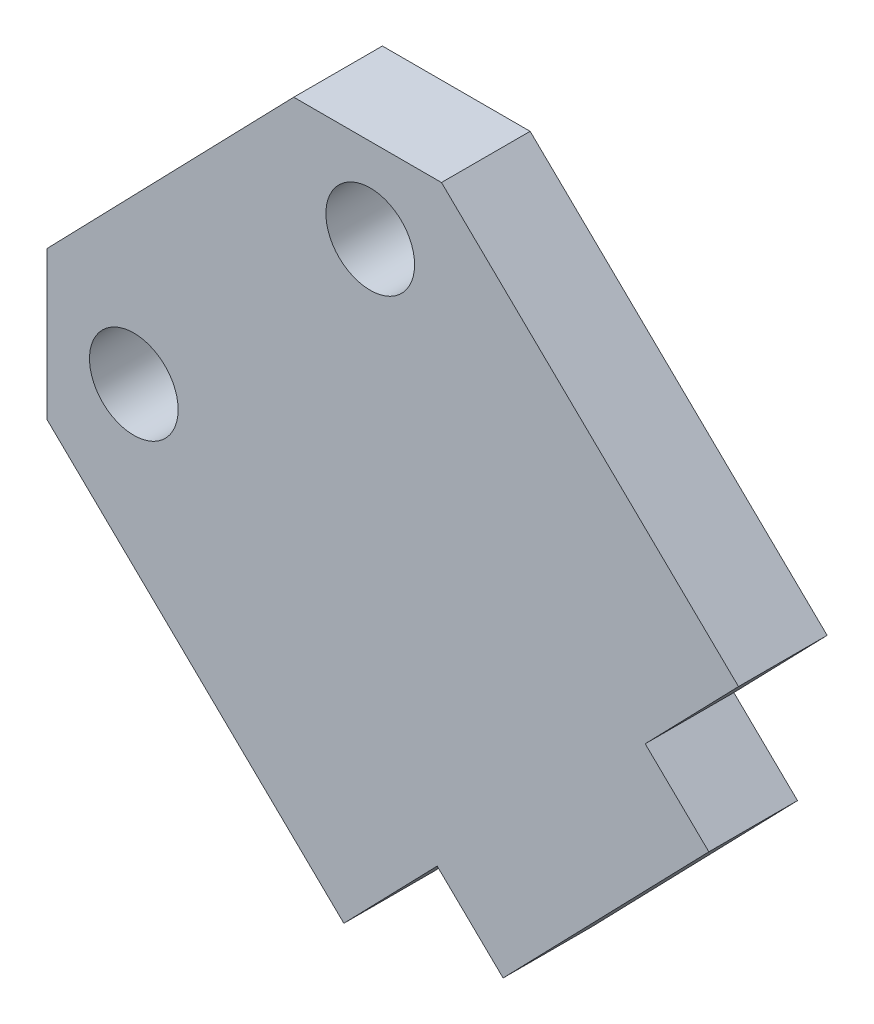
ISO-10303-21;
HEADER;
FILE_DESCRIPTION(('STEP AP214'),'2;1');
FILE_NAME('part.step','',(''),(''),'','','');
FILE_SCHEMA(('AUTOMOTIVE_DESIGN { 1 0 10303 214 1 1 1 1 }'));
ENDSEC;
DATA;
#1=APPLICATION_CONTEXT('core data for automotive mechanical design processes');
#2=APPLICATION_PROTOCOL_DEFINITION('international standard','automotive_design',2000,#1);
#3=PRODUCT_CONTEXT('',#1,'mechanical');
#4=PRODUCT('Part','Part','',(#3));
#5=PRODUCT_RELATED_PRODUCT_CATEGORY('part','',(#4));
#6=PRODUCT_DEFINITION_FORMATION('','',#4);
#7=PRODUCT_DEFINITION_CONTEXT('part definition',#1,'design');
#8=PRODUCT_DEFINITION('design','',#6,#7);
#9=PRODUCT_DEFINITION_SHAPE('','',#8);
#10=(LENGTH_UNIT() NAMED_UNIT(*) SI_UNIT(.MILLI.,.METRE.));
#11=(NAMED_UNIT(*) PLANE_ANGLE_UNIT() SI_UNIT($,.RADIAN.));
#12=(NAMED_UNIT(*) SI_UNIT($,.STERADIAN.) SOLID_ANGLE_UNIT());
#13=UNCERTAINTY_MEASURE_WITH_UNIT(LENGTH_MEASURE(1.E-05),#10,'distance_accuracy_value','');
#14=(GEOMETRIC_REPRESENTATION_CONTEXT(3) GLOBAL_UNCERTAINTY_ASSIGNED_CONTEXT((#13)) GLOBAL_UNIT_ASSIGNED_CONTEXT((#10,
#11,#12)) REPRESENTATION_CONTEXT('',''));
#15=CARTESIAN_POINT('',(0.,0.,0.));
#16=DIRECTION('',(0.,0.,1.));
#17=DIRECTION('',(1.,0.,0.));
#18=AXIS2_PLACEMENT_3D('',#15,#16,#17);
#19=CARTESIAN_POINT('',(0.,0.,3.));
#20=DIRECTION('',(0.,0.,-1.));
#21=DIRECTION('',(-1.,0.,0.));
#22=AXIS2_PLACEMENT_3D('',#19,#20,#21);
#23=PLANE('',#22);
#24=DIRECTION('',(0.,-1.,0.));
#25=VECTOR('',#24,1.);
#26=CARTESIAN_POINT('',(-10.9431024509209,-10.75,3.));
#27=LINE('',#26,#25);
#28=CARTESIAN_POINT('',(-10.9431024509209,-5.75,3.));
#29=VERTEX_POINT('',#28);
#30=CARTESIAN_POINT('',(-10.9431024509209,-10.75,3.));
#31=VERTEX_POINT('',#30);
#32=EDGE_CURVE('E169',#29,#31,#27,.T.);
#33=ORIENTED_EDGE('',*,*,#32,.T.);
#34=DIRECTION('',(0.717900393451055,-0.69614583607375,0.));
#35=VECTOR('',#34,1.);
#36=CARTESIAN_POINT('',(-0.892496942606136,-20.4960417050325,3.));
#37=LINE('',#36,#35);
#38=CARTESIAN_POINT('',(-0.892496942606136,-20.4960417050325,3.));
#39=VERTEX_POINT('',#38);
#40=EDGE_CURVE('E107',#31,#39,#37,.T.);
#41=ORIENTED_EDGE('',*,*,#40,.T.);
#42=DIRECTION('',(0.69614583607375,0.717900393451055,0.));
#43=VECTOR('',#42,1.);
#44=CARTESIAN_POINT('',(-0.892496942606136,-20.4960417050325,3.));
#45=LINE('',#44,#43);
#46=CARTESIAN_POINT('',(2.26460488021631,-17.2402804502468,3.));
#47=VERTEX_POINT('',#46);
#48=EDGE_CURVE('E190',#39,#47,#45,.T.);
#49=ORIENTED_EDGE('',*,*,#48,.T.);
#50=DIRECTION('',(0.717900393451054,-0.69614583607375,0.));
#51=VECTOR('',#50,1.);
#52=CARTESIAN_POINT('',(2.26460488021631,-17.2402804502468,3.));
#53=LINE('',#52,#51);
#54=CARTESIAN_POINT('',(4.49639408707208,-19.4044396811373,3.));
#55=VERTEX_POINT('',#54);
#56=EDGE_CURVE('E209',#47,#55,#53,.T.);
#57=ORIENTED_EDGE('',*,*,#56,.T.);
#58=DIRECTION('',(0.69614583607375,0.717900393451055,0.));
#59=VECTOR('',#58,1.);
#60=CARTESIAN_POINT('',(4.49639408707208,-19.4044396811373,3.));
#61=LINE('',#60,#59);
#62=CARTESIAN_POINT('',(11.4578524478096,-12.2254357466267,3.));
#63=VERTEX_POINT('',#62);
#64=EDGE_CURVE('E206',#55,#63,#61,.T.);
#65=ORIENTED_EDGE('',*,*,#64,.T.);
#66=DIRECTION('',(-0.717900393451056,0.696145836073749,0.));
#67=VECTOR('',#66,1.);
#68=CARTESIAN_POINT('',(11.4578524478096,-12.2254357466267,3.));
#69=LINE('',#68,#67);
#70=CARTESIAN_POINT('',(9.30415126745642,-10.1369982384055,3.));
#71=VERTEX_POINT('',#70);
#72=EDGE_CURVE('E208',#63,#71,#69,.T.);
#73=ORIENTED_EDGE('',*,*,#72,.T.);
#74=DIRECTION('',(0.69614583607375,0.717900393451055,0.));
#75=VECTOR('',#74,1.);
#76=CARTESIAN_POINT('',(9.30415126745642,-10.1369982384055,3.));
#77=LINE('',#76,#75);
#78=CARTESIAN_POINT('',(12.4612530902789,-6.88123698361985,3.));
#79=VERTEX_POINT('',#78);
#80=EDGE_CURVE('E132',#71,#79,#77,.T.);
#81=ORIENTED_EDGE('',*,*,#80,.T.);
#82=DIRECTION('',(-0.717900393451055,0.69614583607375,0.));
#83=VECTOR('',#82,1.);
#84=CARTESIAN_POINT('',(2.41064758196409,2.86480472141266,3.));
#85=LINE('',#84,#83);
#86=CARTESIAN_POINT('',(2.41064758196409,2.86480472141266,3.));
#87=VERTEX_POINT('',#86);
#88=EDGE_CURVE('E126',#79,#87,#85,.T.);
#89=ORIENTED_EDGE('',*,*,#88,.T.);
#90=DIRECTION('',(-1.,0.,0.));
#91=VECTOR('',#90,1.);
#92=CARTESIAN_POINT('',(-2.58935241803591,2.86480472141266,3.));
#93=LINE('',#92,#91);
#94=CARTESIAN_POINT('',(-2.58935241803591,2.86480472141266,3.));
#95=VERTEX_POINT('',#94);
#96=EDGE_CURVE('E130',#87,#95,#93,.T.);
#97=ORIENTED_EDGE('',*,*,#96,.T.);
#98=DIRECTION('',(-0.69614583607375,-0.717900393451055,0.));
#99=VECTOR('',#98,1.);
#100=CARTESIAN_POINT('',(-10.9431024509209,-5.75,3.));
#101=LINE('',#100,#99);
#102=EDGE_CURVE('E58',#95,#29,#101,.T.);
#103=ORIENTED_EDGE('',*,*,#102,.T.);
#104=EDGE_LOOP('',(#33,#41,#49,#57,#65,#73,#81,#89,#97,#103));
#105=FACE_BOUND('',#104,.T.);
#106=CARTESIAN_POINT('',(0.,0.,3.));
#107=DIRECTION('',(0.,0.,1.));
#108=DIRECTION('',(1.,0.,0.));
#109=AXIS2_PLACEMENT_3D('',#106,#107,#108);
#110=CIRCLE('',#109,1.5);
#111=CARTESIAN_POINT('',(1.5,0.,3.));
#112=VERTEX_POINT('',#111);
#113=EDGE_CURVE('E154',#112,#112,#110,.T.);
#114=ORIENTED_EDGE('',*,*,#113,.F.);
#115=EDGE_LOOP('',(#114));
#116=FACE_BOUND('',#115,.T.);
#117=CARTESIAN_POINT('',(-8.,-8.25,3.));
#118=DIRECTION('',(0.,0.,1.));
#119=DIRECTION('',(1.,0.,0.));
#120=AXIS2_PLACEMENT_3D('',#117,#118,#119);
#121=CIRCLE('',#120,1.5);
#122=CARTESIAN_POINT('',(-6.5,-8.25,3.));
#123=VERTEX_POINT('',#122);
#124=EDGE_CURVE('E220',#123,#123,#121,.T.);
#125=ORIENTED_EDGE('',*,*,#124,.F.);
#126=EDGE_LOOP('',(#125));
#127=FACE_BOUND('',#126,.T.);
#128=ADVANCED_FACE('F41',(#105,#116,#127),#23,.F.);
#129=CARTESIAN_POINT('',(0.,0.,0.));
#130=DIRECTION('',(0.,0.,-1.));
#131=DIRECTION('',(-1.,0.,0.));
#132=AXIS2_PLACEMENT_3D('',#129,#130,#131);
#133=PLANE('',#132);
#134=CARTESIAN_POINT('',(0.,0.,0.));
#135=DIRECTION('',(0.,0.,1.));
#136=DIRECTION('',(1.,0.,0.));
#137=AXIS2_PLACEMENT_3D('',#134,#135,#136);
#138=CIRCLE('',#137,1.5);
#139=CARTESIAN_POINT('',(1.5,0.,0.));
#140=VERTEX_POINT('',#139);
#141=EDGE_CURVE('E217',#140,#140,#138,.T.);
#142=ORIENTED_EDGE('',*,*,#141,.T.);
#143=EDGE_LOOP('',(#142));
#144=FACE_BOUND('',#143,.T.);
#145=DIRECTION('',(0.,-1.,0.));
#146=VECTOR('',#145,1.);
#147=CARTESIAN_POINT('',(-10.9431024509209,-10.75,0.));
#148=LINE('',#147,#146);
#149=CARTESIAN_POINT('',(-10.9431024509209,-5.75,0.));
#150=VERTEX_POINT('',#149);
#151=CARTESIAN_POINT('',(-10.9431024509209,-10.75,0.));
#152=VERTEX_POINT('',#151);
#153=EDGE_CURVE('E150',#150,#152,#148,.T.);
#154=ORIENTED_EDGE('',*,*,#153,.F.);
#155=DIRECTION('',(-0.69614583607375,-0.717900393451055,0.));
#156=VECTOR('',#155,1.);
#157=CARTESIAN_POINT('',(-10.9431024509209,-5.75,0.));
#158=LINE('',#157,#156);
#159=CARTESIAN_POINT('',(-2.58935241803591,2.86480472141266,0.));
#160=VERTEX_POINT('',#159);
#161=EDGE_CURVE('E99',#160,#150,#158,.T.);
#162=ORIENTED_EDGE('',*,*,#161,.F.);
#163=DIRECTION('',(-1.,0.,0.));
#164=VECTOR('',#163,1.);
#165=CARTESIAN_POINT('',(-2.58935241803591,2.86480472141266,0.));
#166=LINE('',#165,#164);
#167=CARTESIAN_POINT('',(2.41064758196409,2.86480472141266,0.));
#168=VERTEX_POINT('',#167);
#169=EDGE_CURVE('E93',#168,#160,#166,.T.);
#170=ORIENTED_EDGE('',*,*,#169,.F.);
#171=DIRECTION('',(-0.717900393451055,0.69614583607375,0.));
#172=VECTOR('',#171,1.);
#173=CARTESIAN_POINT('',(2.41064758196409,2.86480472141266,0.));
#174=LINE('',#173,#172);
#175=CARTESIAN_POINT('',(12.4612530902789,-6.88123698361985,0.));
#176=VERTEX_POINT('',#175);
#177=EDGE_CURVE('E140',#176,#168,#174,.T.);
#178=ORIENTED_EDGE('',*,*,#177,.F.);
#179=DIRECTION('',(0.69614583607375,0.717900393451055,0.));
#180=VECTOR('',#179,1.);
#181=CARTESIAN_POINT('',(9.30415126745642,-10.1369982384055,0.));
#182=LINE('',#181,#180);
#183=CARTESIAN_POINT('',(9.30415126745642,-10.1369982384055,0.));
#184=VERTEX_POINT('',#183);
#185=EDGE_CURVE('E164',#184,#176,#182,.T.);
#186=ORIENTED_EDGE('',*,*,#185,.F.);
#187=DIRECTION('',(-0.717900393451056,0.696145836073749,0.));
#188=VECTOR('',#187,1.);
#189=CARTESIAN_POINT('',(11.4578524478096,-12.2254357466267,0.));
#190=LINE('',#189,#188);
#191=CARTESIAN_POINT('',(11.4578524478096,-12.2254357466267,0.));
#192=VERTEX_POINT('',#191);
#193=EDGE_CURVE('E162',#192,#184,#190,.T.);
#194=ORIENTED_EDGE('',*,*,#193,.F.);
#195=DIRECTION('',(0.69614583607375,0.717900393451055,0.));
#196=VECTOR('',#195,1.);
#197=CARTESIAN_POINT('',(4.49639408707208,-19.4044396811373,0.));
#198=LINE('',#197,#196);
#199=CARTESIAN_POINT('',(4.49639408707208,-19.4044396811373,0.));
#200=VERTEX_POINT('',#199);
#201=EDGE_CURVE('E160',#200,#192,#198,.T.);
#202=ORIENTED_EDGE('',*,*,#201,.F.);
#203=DIRECTION('',(0.717900393451054,-0.69614583607375,0.));
#204=VECTOR('',#203,1.);
#205=CARTESIAN_POINT('',(2.26460488021631,-17.2402804502468,0.));
#206=LINE('',#205,#204);
#207=CARTESIAN_POINT('',(2.26460488021631,-17.2402804502468,0.));
#208=VERTEX_POINT('',#207);
#209=EDGE_CURVE('E158',#208,#200,#206,.T.);
#210=ORIENTED_EDGE('',*,*,#209,.F.);
#211=DIRECTION('',(0.69614583607375,0.717900393451055,0.));
#212=VECTOR('',#211,1.);
#213=CARTESIAN_POINT('',(-0.892496942606136,-20.4960417050325,0.));
#214=LINE('',#213,#212);
#215=CARTESIAN_POINT('',(-0.892496942606136,-20.4960417050325,0.));
#216=VERTEX_POINT('',#215);
#217=EDGE_CURVE('E156',#216,#208,#214,.T.);
#218=ORIENTED_EDGE('',*,*,#217,.F.);
#219=DIRECTION('',(0.717900393451055,-0.69614583607375,0.));
#220=VECTOR('',#219,1.);
#221=CARTESIAN_POINT('',(-0.892496942606136,-20.4960417050325,0.));
#222=LINE('',#221,#220);
#223=EDGE_CURVE('E153',#152,#216,#222,.T.);
#224=ORIENTED_EDGE('',*,*,#223,.F.);
#225=EDGE_LOOP('',(#154,#162,#170,#178,#186,#194,#202,#210,#218,#224));
#226=FACE_BOUND('',#225,.T.);
#227=CARTESIAN_POINT('',(-8.,-8.25,0.));
#228=DIRECTION('',(0.,0.,1.));
#229=DIRECTION('',(1.,0.,0.));
#230=AXIS2_PLACEMENT_3D('',#227,#228,#229);
#231=CIRCLE('',#230,1.5);
#232=CARTESIAN_POINT('',(-6.5,-8.25,0.));
#233=VERTEX_POINT('',#232);
#234=EDGE_CURVE('E223',#233,#233,#231,.T.);
#235=ORIENTED_EDGE('',*,*,#234,.T.);
#236=EDGE_LOOP('',(#235));
#237=FACE_BOUND('',#236,.T.);
#238=ADVANCED_FACE('F194',(#144,#226,#237),#133,.T.);
#239=CARTESIAN_POINT('',(-10.9431024509209,-10.75,3.));
#240=DIRECTION('',(1.,0.,0.));
#241=DIRECTION('',(0.,0.,-1.));
#242=AXIS2_PLACEMENT_3D('',#239,#240,#241);
#243=PLANE('',#242);
#244=ORIENTED_EDGE('',*,*,#153,.T.);
#245=DIRECTION('',(0.,0.,-1.));
#246=VECTOR('',#245,1.);
#247=CARTESIAN_POINT('',(-10.9431024509209,-10.75,3.));
#248=LINE('',#247,#246);
#249=EDGE_CURVE('E11',#31,#152,#248,.T.);
#250=ORIENTED_EDGE('',*,*,#249,.F.);
#251=ORIENTED_EDGE('',*,*,#32,.F.);
#252=DIRECTION('',(0.,0.,-1.));
#253=VECTOR('',#252,1.);
#254=CARTESIAN_POINT('',(-10.9431024509209,-5.75,3.));
#255=LINE('',#254,#253);
#256=EDGE_CURVE('E146',#29,#150,#255,.T.);
#257=ORIENTED_EDGE('',*,*,#256,.T.);
#258=EDGE_LOOP('',(#244,#250,#251,#257));
#259=FACE_BOUND('',#258,.T.);
#260=ADVANCED_FACE('F43',(#259),#243,.F.);
#261=CARTESIAN_POINT('',(-0.892496942606136,-20.4960417050325,3.));
#262=DIRECTION('',(0.69614583607375,0.717900393451055,0.));
#263=DIRECTION('',(-0.717900393451055,0.69614583607375,0.));
#264=AXIS2_PLACEMENT_3D('',#261,#262,#263);
#265=PLANE('',#264);
#266=ORIENTED_EDGE('',*,*,#223,.T.);
#267=DIRECTION('',(0.,0.,-1.));
#268=VECTOR('',#267,1.);
#269=CARTESIAN_POINT('',(-0.892496942606136,-20.4960417050325,3.));
#270=LINE('',#269,#268);
#271=EDGE_CURVE('E50',#39,#216,#270,.T.);
#272=ORIENTED_EDGE('',*,*,#271,.F.);
#273=ORIENTED_EDGE('',*,*,#40,.F.);
#274=ORIENTED_EDGE('',*,*,#249,.T.);
#275=EDGE_LOOP('',(#266,#272,#273,#274));
#276=FACE_BOUND('',#275,.T.);
#277=ADVANCED_FACE('F263',(#276),#265,.F.);
#278=CARTESIAN_POINT('',(-0.892496942606136,-20.4960417050325,3.));
#279=DIRECTION('',(-0.717900393451055,0.69614583607375,0.));
#280=DIRECTION('',(-0.69614583607375,-0.717900393451055,0.));
#281=AXIS2_PLACEMENT_3D('',#278,#279,#280);
#282=PLANE('',#281);
#283=ORIENTED_EDGE('',*,*,#217,.T.);
#284=DIRECTION('',(0.,0.,-1.));
#285=VECTOR('',#284,1.);
#286=CARTESIAN_POINT('',(2.26460488021631,-17.2402804502468,3.));
#287=LINE('',#286,#285);
#288=EDGE_CURVE('E182',#47,#208,#287,.T.);
#289=ORIENTED_EDGE('',*,*,#288,.F.);
#290=ORIENTED_EDGE('',*,*,#48,.F.);
#291=ORIENTED_EDGE('',*,*,#271,.T.);
#292=EDGE_LOOP('',(#283,#289,#290,#291));
#293=FACE_BOUND('',#292,.T.);
#294=ADVANCED_FACE('F188',(#293),#282,.F.);
#295=CARTESIAN_POINT('',(2.26460488021631,-17.2402804502468,3.));
#296=DIRECTION('',(0.69614583607375,0.717900393451055,0.));
#297=DIRECTION('',(-0.717900393451055,0.69614583607375,0.));
#298=AXIS2_PLACEMENT_3D('',#295,#296,#297);
#299=PLANE('',#298);
#300=ORIENTED_EDGE('',*,*,#209,.T.);
#301=DIRECTION('',(0.,0.,-1.));
#302=VECTOR('',#301,1.);
#303=CARTESIAN_POINT('',(4.49639408707208,-19.4044396811373,3.));
#304=LINE('',#303,#302);
#305=EDGE_CURVE('E179',#55,#200,#304,.T.);
#306=ORIENTED_EDGE('',*,*,#305,.F.);
#307=ORIENTED_EDGE('',*,*,#56,.F.);
#308=ORIENTED_EDGE('',*,*,#288,.T.);
#309=EDGE_LOOP('',(#300,#306,#307,#308));
#310=FACE_BOUND('',#309,.T.);
#311=ADVANCED_FACE('F200',(#310),#299,.F.);
#312=CARTESIAN_POINT('',(4.49639408707208,-19.4044396811373,3.));
#313=DIRECTION('',(-0.717900393451055,0.69614583607375,0.));
#314=DIRECTION('',(-0.69614583607375,-0.717900393451055,0.));
#315=AXIS2_PLACEMENT_3D('',#312,#313,#314);
#316=PLANE('',#315);
#317=ORIENTED_EDGE('',*,*,#201,.T.);
#318=DIRECTION('',(0.,0.,-1.));
#319=VECTOR('',#318,1.);
#320=CARTESIAN_POINT('',(11.4578524478096,-12.2254357466267,3.));
#321=LINE('',#320,#319);
#322=EDGE_CURVE('E176',#63,#192,#321,.T.);
#323=ORIENTED_EDGE('',*,*,#322,.F.);
#324=ORIENTED_EDGE('',*,*,#64,.F.);
#325=ORIENTED_EDGE('',*,*,#305,.T.);
#326=EDGE_LOOP('',(#317,#323,#324,#325));
#327=FACE_BOUND('',#326,.T.);
#328=ADVANCED_FACE('F204',(#327),#316,.F.);
#329=CARTESIAN_POINT('',(11.4578524478096,-12.2254357466267,3.));
#330=DIRECTION('',(-0.696145836073749,-0.717900393451056,0.));
#331=DIRECTION('',(0.717900393451056,-0.696145836073749,0.));
#332=AXIS2_PLACEMENT_3D('',#329,#330,#331);
#333=PLANE('',#332);
#334=ORIENTED_EDGE('',*,*,#193,.T.);
#335=DIRECTION('',(0.,0.,-1.));
#336=VECTOR('',#335,1.);
#337=CARTESIAN_POINT('',(9.30415126745642,-10.1369982384055,3.));
#338=LINE('',#337,#336);
#339=EDGE_CURVE('E173',#71,#184,#338,.T.);
#340=ORIENTED_EDGE('',*,*,#339,.F.);
#341=ORIENTED_EDGE('',*,*,#72,.F.);
#342=ORIENTED_EDGE('',*,*,#322,.T.);
#343=EDGE_LOOP('',(#334,#340,#341,#342));
#344=FACE_BOUND('',#343,.T.);
#345=ADVANCED_FACE('F253',(#344),#333,.F.);
#346=CARTESIAN_POINT('',(9.30415126745642,-10.1369982384055,3.));
#347=DIRECTION('',(-0.717900393451055,0.69614583607375,0.));
#348=DIRECTION('',(-0.69614583607375,-0.717900393451055,0.));
#349=AXIS2_PLACEMENT_3D('',#346,#347,#348);
#350=PLANE('',#349);
#351=ORIENTED_EDGE('',*,*,#185,.T.);
#352=DIRECTION('',(0.,0.,-1.));
#353=VECTOR('',#352,1.);
#354=CARTESIAN_POINT('',(12.4612530902789,-6.88123698361985,3.));
#355=LINE('',#354,#353);
#356=EDGE_CURVE('E141',#79,#176,#355,.T.);
#357=ORIENTED_EDGE('',*,*,#356,.F.);
#358=ORIENTED_EDGE('',*,*,#80,.F.);
#359=ORIENTED_EDGE('',*,*,#339,.T.);
#360=EDGE_LOOP('',(#351,#357,#358,#359));
#361=FACE_BOUND('',#360,.T.);
#362=ADVANCED_FACE('F250',(#361),#350,.F.);
#363=CARTESIAN_POINT('',(2.41064758196409,2.86480472141266,3.));
#364=DIRECTION('',(-0.69614583607375,-0.717900393451055,0.));
#365=DIRECTION('',(0.717900393451055,-0.69614583607375,0.));
#366=AXIS2_PLACEMENT_3D('',#363,#364,#365);
#367=PLANE('',#366);
#368=ORIENTED_EDGE('',*,*,#177,.T.);
#369=DIRECTION('',(0.,0.,-1.));
#370=VECTOR('',#369,1.);
#371=CARTESIAN_POINT('',(2.41064758196409,2.86480472141266,3.));
#372=LINE('',#371,#370);
#373=EDGE_CURVE('E137',#87,#168,#372,.T.);
#374=ORIENTED_EDGE('',*,*,#373,.F.);
#375=ORIENTED_EDGE('',*,*,#88,.F.);
#376=ORIENTED_EDGE('',*,*,#356,.T.);
#377=EDGE_LOOP('',(#368,#374,#375,#376));
#378=FACE_BOUND('',#377,.T.);
#379=ADVANCED_FACE('F138',(#378),#367,.F.);
#380=CARTESIAN_POINT('',(-2.58935241803591,2.86480472141266,3.));
#381=DIRECTION('',(0.,-1.,0.));
#382=DIRECTION('',(1.,0.,0.));
#383=AXIS2_PLACEMENT_3D('',#380,#381,#382);
#384=PLANE('',#383);
#385=ORIENTED_EDGE('',*,*,#169,.T.);
#386=DIRECTION('',(0.,0.,-1.));
#387=VECTOR('',#386,1.);
#388=CARTESIAN_POINT('',(-2.58935241803591,2.86480472141266,3.));
#389=LINE('',#388,#387);
#390=EDGE_CURVE('E142',#95,#160,#389,.T.);
#391=ORIENTED_EDGE('',*,*,#390,.F.);
#392=ORIENTED_EDGE('',*,*,#96,.F.);
#393=ORIENTED_EDGE('',*,*,#373,.T.);
#394=EDGE_LOOP('',(#385,#391,#392,#393));
#395=FACE_BOUND('',#394,.T.);
#396=ADVANCED_FACE('F144',(#395),#384,.F.);
#397=CARTESIAN_POINT('',(-10.9431024509209,-5.75,3.));
#398=DIRECTION('',(0.717900393451055,-0.69614583607375,0.));
#399=DIRECTION('',(0.69614583607375,0.717900393451055,0.));
#400=AXIS2_PLACEMENT_3D('',#397,#398,#399);
#401=PLANE('',#400);
#402=ORIENTED_EDGE('',*,*,#161,.T.);
#403=ORIENTED_EDGE('',*,*,#256,.F.);
#404=ORIENTED_EDGE('',*,*,#102,.F.);
#405=ORIENTED_EDGE('',*,*,#390,.T.);
#406=EDGE_LOOP('',(#402,#403,#404,#405));
#407=FACE_BOUND('',#406,.T.);
#408=ADVANCED_FACE('F243',(#407),#401,.F.);
#409=CARTESIAN_POINT('',(0.,0.,3.));
#410=DIRECTION('',(0.,0.,-1.));
#411=DIRECTION('',(-1.,0.,0.));
#412=AXIS2_PLACEMENT_3D('',#409,#410,#411);
#413=CYLINDRICAL_SURFACE('',#412,1.5);
#414=ORIENTED_EDGE('',*,*,#113,.T.);
#415=EDGE_LOOP('',(#414));
#416=FACE_BOUND('',#415,.T.);
#417=ORIENTED_EDGE('',*,*,#141,.F.);
#418=EDGE_LOOP('',(#417));
#419=FACE_BOUND('',#418,.T.);
#420=ADVANCED_FACE('F240',(#416,#419),#413,.F.);
#421=CARTESIAN_POINT('',(-8.,-8.25,3.));
#422=DIRECTION('',(0.,0.,-1.));
#423=DIRECTION('',(-1.,0.,0.));
#424=AXIS2_PLACEMENT_3D('',#421,#422,#423);
#425=CYLINDRICAL_SURFACE('',#424,1.5);
#426=ORIENTED_EDGE('',*,*,#124,.T.);
#427=EDGE_LOOP('',(#426));
#428=FACE_BOUND('',#427,.T.);
#429=ORIENTED_EDGE('',*,*,#234,.F.);
#430=EDGE_LOOP('',(#429));
#431=FACE_BOUND('',#430,.T.);
#432=ADVANCED_FACE('F229',(#428,#431),#425,.F.);
#433=CLOSED_SHELL('',(#128,#238,#260,#277,#294,#311,#328,#345,#362,#379,#396,#408,#420,#432));
#434=MANIFOLD_SOLID_BREP('B2',#433);
#435=ADVANCED_BREP_SHAPE_REPRESENTATION('',(#18,#434),#14);
#436=SHAPE_DEFINITION_REPRESENTATION(#9,#435);
ENDSEC;
END-ISO-10303-21;
